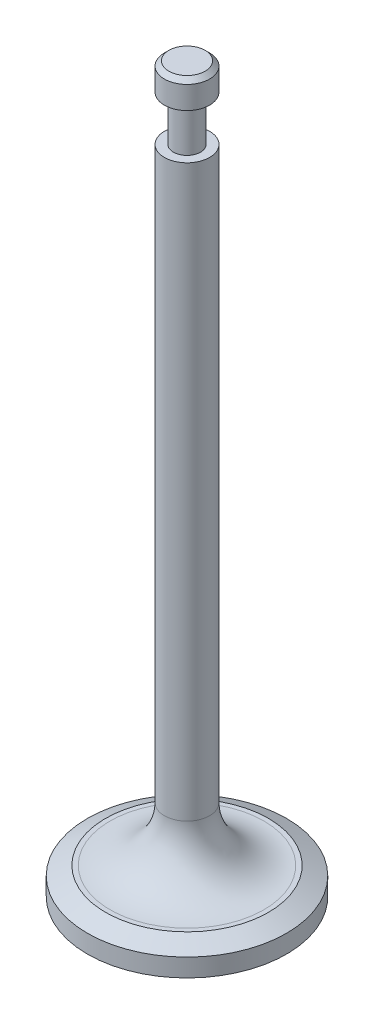
ISO-10303-21;
HEADER;
FILE_DESCRIPTION(('STEP AP214'),'2;1');
FILE_NAME('part.step','',(''),(''),'','','');
FILE_SCHEMA(('AUTOMOTIVE_DESIGN { 1 0 10303 214 1 1 1 1 }'));
ENDSEC;
DATA;
#1=APPLICATION_CONTEXT('core data for automotive mechanical design processes');
#2=APPLICATION_PROTOCOL_DEFINITION('international standard','automotive_design',2000,#1);
#3=PRODUCT_CONTEXT('',#1,'mechanical');
#4=PRODUCT('Part','Part','',(#3));
#5=PRODUCT_RELATED_PRODUCT_CATEGORY('part','',(#4));
#6=PRODUCT_DEFINITION_FORMATION('','',#4);
#7=PRODUCT_DEFINITION_CONTEXT('part definition',#1,'design');
#8=PRODUCT_DEFINITION('design','',#6,#7);
#9=PRODUCT_DEFINITION_SHAPE('','',#8);
#10=(LENGTH_UNIT() NAMED_UNIT(*) SI_UNIT(.MILLI.,.METRE.));
#11=(NAMED_UNIT(*) PLANE_ANGLE_UNIT() SI_UNIT($,.RADIAN.));
#12=(NAMED_UNIT(*) SI_UNIT($,.STERADIAN.) SOLID_ANGLE_UNIT());
#13=UNCERTAINTY_MEASURE_WITH_UNIT(LENGTH_MEASURE(1.E-05),#10,'distance_accuracy_value','');
#14=(GEOMETRIC_REPRESENTATION_CONTEXT(3) GLOBAL_UNCERTAINTY_ASSIGNED_CONTEXT((#13)) GLOBAL_UNIT_ASSIGNED_CONTEXT((#10,
#11,#12)) REPRESENTATION_CONTEXT('',''));
#15=CARTESIAN_POINT('',(0.,0.,0.));
#16=DIRECTION('',(0.,0.,1.));
#17=DIRECTION('',(1.,0.,0.));
#18=AXIS2_PLACEMENT_3D('',#15,#16,#17);
#19=CARTESIAN_POINT('',(0.,0.,-2.50000000000002));
#20=DIRECTION('',(0.,-1.,0.));
#21=DIRECTION('',(0.,0.,-1.));
#22=AXIS2_PLACEMENT_3D('',#19,#20,#21);
#23=PLANE('',#22);
#24=CARTESIAN_POINT('',(0.,0.,0.));
#25=DIRECTION('',(0.,-1.,0.));
#26=DIRECTION('',(0.,0.,-1.));
#27=AXIS2_PLACEMENT_3D('',#24,#25,#26);
#28=CIRCLE('',#27,2.00000000000002);
#29=CARTESIAN_POINT('',(0.,0.,-2.00000000000002));
#30=VERTEX_POINT('',#29);
#31=EDGE_CURVE('E43',#30,#30,#28,.F.);
#32=ORIENTED_EDGE('',*,*,#31,.T.);
#33=EDGE_LOOP('',(#32));
#34=FACE_BOUND('',#33,.T.);
#35=ADVANCED_FACE('F35',(#34),#23,.F.);
#36=CARTESIAN_POINT('',(0.,-80.,0.));
#37=DIRECTION('',(0.,1.,0.));
#38=DIRECTION('',(0.,0.,1.));
#39=AXIS2_PLACEMENT_3D('',#36,#37,#38);
#40=PLANE('',#39);
#41=CARTESIAN_POINT('',(0.,-80.,0.));
#42=DIRECTION('',(0.,1.,0.));
#43=DIRECTION('',(0.,0.,1.));
#44=AXIS2_PLACEMENT_3D('',#41,#42,#43);
#45=CIRCLE('',#44,11.);
#46=CARTESIAN_POINT('',(0.,-80.,11.));
#47=VERTEX_POINT('',#46);
#48=EDGE_CURVE('E62',#47,#47,#45,.T.);
#49=ORIENTED_EDGE('',*,*,#48,.F.);
#50=EDGE_LOOP('',(#49));
#51=FACE_BOUND('',#50,.T.);
#52=ADVANCED_FACE('F110',(#51),#40,.F.);
#53=CARTESIAN_POINT('',(0.,0.,0.));
#54=DIRECTION('',(0.,1.,0.));
#55=DIRECTION('',(0.,0.,1.));
#56=AXIS2_PLACEMENT_3D('',#53,#54,#55);
#57=CYLINDRICAL_SURFACE('',#56,11.);
#58=CARTESIAN_POINT('',(0.,-78.,0.));
#59=DIRECTION('',(0.,-1.,0.));
#60=DIRECTION('',(0.,0.,-1.));
#61=AXIS2_PLACEMENT_3D('',#58,#59,#60);
#62=CIRCLE('',#61,11.);
#63=CARTESIAN_POINT('',(0.,-78.,-11.));
#64=VERTEX_POINT('',#63);
#65=EDGE_CURVE('E47',#64,#64,#62,.T.);
#66=ORIENTED_EDGE('',*,*,#65,.T.);
#67=EDGE_LOOP('',(#66));
#68=FACE_BOUND('',#67,.T.);
#69=ORIENTED_EDGE('',*,*,#48,.T.);
#70=EDGE_LOOP('',(#69));
#71=FACE_BOUND('',#70,.T.);
#72=ADVANCED_FACE('F106',(#68,#71),#57,.T.);
#73=CARTESIAN_POINT('',(0.,-77.,-11.));
#74=DIRECTION('',(0.,-1.,0.));
#75=DIRECTION('',(0.,0.,-1.));
#76=AXIS2_PLACEMENT_3D('',#73,#74,#75);
#77=PLANE('',#76);
#78=CARTESIAN_POINT('',(0.,-77.,0.));
#79=DIRECTION('',(0.,-1.,0.));
#80=DIRECTION('',(0.,0.,-1.));
#81=AXIS2_PLACEMENT_3D('',#78,#79,#80);
#82=CIRCLE('',#81,8.99999999999997);
#83=CARTESIAN_POINT('',(0.,-77.,-8.99999999999997));
#84=VERTEX_POINT('',#83);
#85=EDGE_CURVE('E51',#84,#84,#82,.F.);
#86=ORIENTED_EDGE('',*,*,#85,.T.);
#87=EDGE_LOOP('',(#86));
#88=FACE_BOUND('',#87,.T.);
#89=CARTESIAN_POINT('',(0.,-77.,0.));
#90=DIRECTION('',(0.,-1.,0.));
#91=DIRECTION('',(0.,0.,-1.));
#92=AXIS2_PLACEMENT_3D('',#89,#90,#91);
#93=CIRCLE('',#92,8.50000000000001);
#94=CARTESIAN_POINT('',(0.,-77.,-8.50000000000001));
#95=VERTEX_POINT('',#94);
#96=EDGE_CURVE('E56',#95,#95,#93,.T.);
#97=ORIENTED_EDGE('',*,*,#96,.T.);
#98=EDGE_LOOP('',(#97));
#99=FACE_BOUND('',#98,.T.);
#100=ADVANCED_FACE('F100',(#88,#99),#77,.F.);
#101=CARTESIAN_POINT('',(0.,0.,0.));
#102=DIRECTION('',(0.,1.,0.));
#103=DIRECTION('',(0.,0.,1.));
#104=AXIS2_PLACEMENT_3D('',#101,#102,#103);
#105=CYLINDRICAL_SURFACE('',#104,2.50000000000001);
#106=CARTESIAN_POINT('',(0.,-71.,0.));
#107=DIRECTION('',(0.,-1.,0.));
#108=DIRECTION('',(0.,0.,-1.));
#109=AXIS2_PLACEMENT_3D('',#106,#107,#108);
#110=CIRCLE('',#109,2.50000000000001);
#111=CARTESIAN_POINT('',(0.,-71.,-2.50000000000001));
#112=VERTEX_POINT('',#111);
#113=EDGE_CURVE('E59',#112,#112,#110,.F.);
#114=ORIENTED_EDGE('',*,*,#113,.T.);
#115=EDGE_LOOP('',(#114));
#116=FACE_BOUND('',#115,.T.);
#117=CARTESIAN_POINT('',(0.,-8.,0.));
#118=DIRECTION('',(0.,1.,0.));
#119=DIRECTION('',(0.,0.,1.));
#120=AXIS2_PLACEMENT_3D('',#117,#118,#119);
#121=CIRCLE('',#120,2.50000000000001);
#122=CARTESIAN_POINT('',(0.,-8.,2.50000000000001));
#123=VERTEX_POINT('',#122);
#124=EDGE_CURVE('E65',#123,#123,#121,.T.);
#125=ORIENTED_EDGE('',*,*,#124,.F.);
#126=EDGE_LOOP('',(#125));
#127=FACE_BOUND('',#126,.T.);
#128=ADVANCED_FACE('F95',(#116,#127),#105,.T.);
#129=CARTESIAN_POINT('',(0.,-8.,-2.50000000000001));
#130=DIRECTION('',(0.,-1.,0.));
#131=DIRECTION('',(0.,0.,-1.));
#132=AXIS2_PLACEMENT_3D('',#129,#130,#131);
#133=PLANE('',#132);
#134=CARTESIAN_POINT('',(0.,-8.,0.));
#135=DIRECTION('',(0.,1.,0.));
#136=DIRECTION('',(0.,0.,1.));
#137=AXIS2_PLACEMENT_3D('',#134,#135,#136);
#138=CIRCLE('',#137,1.50000000000001);
#139=CARTESIAN_POINT('',(0.,-8.,1.50000000000001));
#140=VERTEX_POINT('',#139);
#141=EDGE_CURVE('E68',#140,#140,#138,.T.);
#142=ORIENTED_EDGE('',*,*,#141,.F.);
#143=EDGE_LOOP('',(#142));
#144=FACE_BOUND('',#143,.T.);
#145=ORIENTED_EDGE('',*,*,#124,.T.);
#146=EDGE_LOOP('',(#145));
#147=FACE_BOUND('',#146,.T.);
#148=ADVANCED_FACE('F89',(#144,#147),#133,.F.);
#149=CARTESIAN_POINT('',(0.,0.,0.));
#150=DIRECTION('',(0.,1.,0.));
#151=DIRECTION('',(0.,0.,1.));
#152=AXIS2_PLACEMENT_3D('',#149,#150,#151);
#153=CYLINDRICAL_SURFACE('',#152,1.50000000000001);
#154=CARTESIAN_POINT('',(0.,-3.,0.));
#155=DIRECTION('',(0.,1.,0.));
#156=DIRECTION('',(0.,0.,1.));
#157=AXIS2_PLACEMENT_3D('',#154,#155,#156);
#158=CIRCLE('',#157,1.50000000000001);
#159=CARTESIAN_POINT('',(0.,-3.,1.50000000000001));
#160=VERTEX_POINT('',#159);
#161=EDGE_CURVE('E71',#160,#160,#158,.T.);
#162=ORIENTED_EDGE('',*,*,#161,.F.);
#163=EDGE_LOOP('',(#162));
#164=FACE_BOUND('',#163,.T.);
#165=ORIENTED_EDGE('',*,*,#141,.T.);
#166=EDGE_LOOP('',(#165));
#167=FACE_BOUND('',#166,.T.);
#168=ADVANCED_FACE('F83',(#164,#167),#153,.T.);
#169=CARTESIAN_POINT('',(0.,-3.,-1.50000000000001));
#170=DIRECTION('',(0.,1.,0.));
#171=DIRECTION('',(0.,0.,1.));
#172=AXIS2_PLACEMENT_3D('',#169,#170,#171);
#173=PLANE('',#172);
#174=CARTESIAN_POINT('',(0.,-3.,0.));
#175=DIRECTION('',(0.,1.,0.));
#176=DIRECTION('',(0.,0.,1.));
#177=AXIS2_PLACEMENT_3D('',#174,#175,#176);
#178=CIRCLE('',#177,2.50000000000002);
#179=CARTESIAN_POINT('',(0.,-3.,2.50000000000002));
#180=VERTEX_POINT('',#179);
#181=EDGE_CURVE('E74',#180,#180,#178,.T.);
#182=ORIENTED_EDGE('',*,*,#181,.F.);
#183=EDGE_LOOP('',(#182));
#184=FACE_BOUND('',#183,.T.);
#185=ORIENTED_EDGE('',*,*,#161,.T.);
#186=EDGE_LOOP('',(#185));
#187=FACE_BOUND('',#186,.T.);
#188=ADVANCED_FACE('F80',(#184,#187),#173,.F.);
#189=CARTESIAN_POINT('',(0.,0.,0.));
#190=DIRECTION('',(0.,1.,0.));
#191=DIRECTION('',(0.,0.,1.));
#192=AXIS2_PLACEMENT_3D('',#189,#190,#191);
#193=CYLINDRICAL_SURFACE('',#192,2.50000000000002);
#194=CARTESIAN_POINT('',(0.,-0.500000000000004,0.));
#195=DIRECTION('',(0.,-1.,0.));
#196=DIRECTION('',(0.,0.,-1.));
#197=AXIS2_PLACEMENT_3D('',#194,#195,#196);
#198=CIRCLE('',#197,2.50000000000002);
#199=CARTESIAN_POINT('',(0.,-0.500000000000004,-2.50000000000002));
#200=VERTEX_POINT('',#199);
#201=EDGE_CURVE('E10',#200,#200,#198,.T.);
#202=ORIENTED_EDGE('',*,*,#201,.T.);
#203=EDGE_LOOP('',(#202));
#204=FACE_BOUND('',#203,.T.);
#205=ORIENTED_EDGE('',*,*,#181,.T.);
#206=EDGE_LOOP('',(#205));
#207=FACE_BOUND('',#206,.T.);
#208=ADVANCED_FACE('F78',(#204,#207),#193,.T.);
#209=CARTESIAN_POINT('',(0.,-71.,0.));
#210=DIRECTION('',(0.,-1.,0.));
#211=DIRECTION('',(0.,0.,-1.));
#212=AXIS2_PLACEMENT_3D('',#209,#210,#211);
#213=TOROIDAL_SURFACE('',#212,8.50000000000001,6.);
#214=ORIENTED_EDGE('',*,*,#96,.F.);
#215=EDGE_LOOP('',(#214));
#216=FACE_BOUND('',#215,.T.);
#217=ORIENTED_EDGE('',*,*,#113,.F.);
#218=EDGE_LOOP('',(#217));
#219=FACE_BOUND('',#218,.T.);
#220=ADVANCED_FACE('F119',(#216,#219),#213,.F.);
#221=CARTESIAN_POINT('',(0.,-77.,0.));
#222=DIRECTION('',(0.,-1.,0.));
#223=DIRECTION('',(0.,0.,-1.));
#224=AXIS2_PLACEMENT_3D('',#221,#222,#223);
#225=CONICAL_SURFACE('',#224,8.99999999999997,1.10714871779409);
#226=ORIENTED_EDGE('',*,*,#65,.F.);
#227=EDGE_LOOP('',(#226));
#228=FACE_BOUND('',#227,.T.);
#229=ORIENTED_EDGE('',*,*,#85,.F.);
#230=EDGE_LOOP('',(#229));
#231=FACE_BOUND('',#230,.T.);
#232=ADVANCED_FACE('F121',(#228,#231),#225,.T.);
#233=CARTESIAN_POINT('',(0.,0.,0.));
#234=DIRECTION('',(0.,-1.,0.));
#235=DIRECTION('',(0.,0.,-1.));
#236=AXIS2_PLACEMENT_3D('',#233,#234,#235);
#237=CONICAL_SURFACE('',#236,2.00000000000002,0.78539816339744);
#238=ORIENTED_EDGE('',*,*,#201,.F.);
#239=EDGE_LOOP('',(#238));
#240=FACE_BOUND('',#239,.T.);
#241=ORIENTED_EDGE('',*,*,#31,.F.);
#242=EDGE_LOOP('',(#241));
#243=FACE_BOUND('',#242,.T.);
#244=ADVANCED_FACE('F38',(#240,#243),#237,.T.);
#245=CLOSED_SHELL('',(#35,#52,#72,#100,#128,#148,#168,#188,#208,#220,#232,#244));
#246=MANIFOLD_SOLID_BREP('B2',#245);
#247=ADVANCED_BREP_SHAPE_REPRESENTATION('',(#18,#246),#14);
#248=SHAPE_DEFINITION_REPRESENTATION(#9,#247);
ENDSEC;
END-ISO-10303-21;
